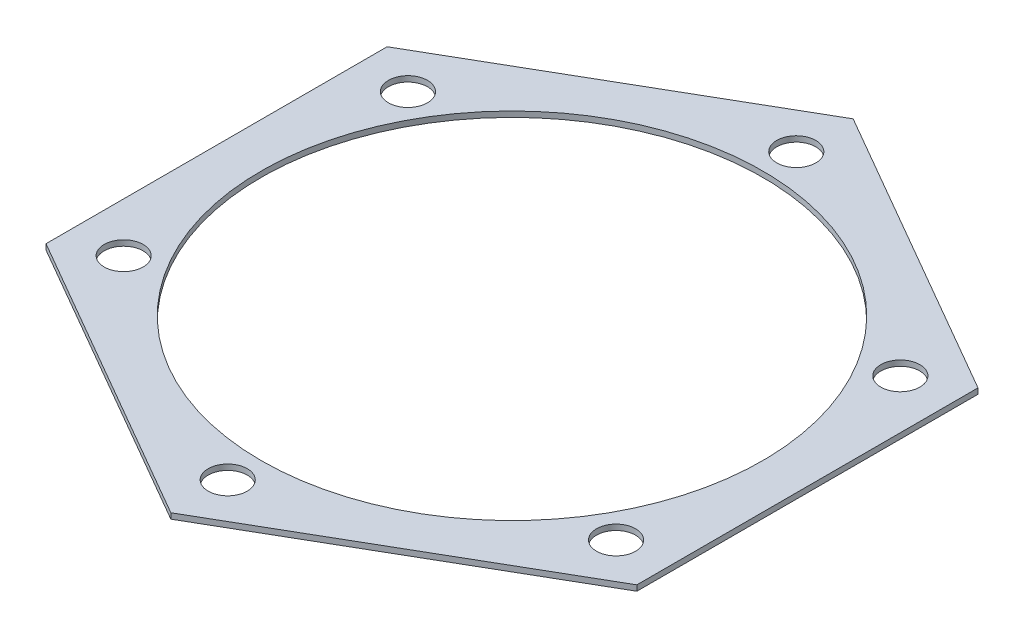
ISO-10303-21;
HEADER;
FILE_DESCRIPTION(('STEP AP214'),'2;1');
FILE_NAME('part.step','',(''),(''),'','','');
FILE_SCHEMA(('AUTOMOTIVE_DESIGN { 1 0 10303 214 1 1 1 1 }'));
ENDSEC;
DATA;
#1=APPLICATION_CONTEXT('core data for automotive mechanical design processes');
#2=APPLICATION_PROTOCOL_DEFINITION('international standard','automotive_design',2000,#1);
#3=PRODUCT_CONTEXT('',#1,'mechanical');
#4=PRODUCT('Part','Part','',(#3));
#5=PRODUCT_RELATED_PRODUCT_CATEGORY('part','',(#4));
#6=PRODUCT_DEFINITION_FORMATION('','',#4);
#7=PRODUCT_DEFINITION_CONTEXT('part definition',#1,'design');
#8=PRODUCT_DEFINITION('design','',#6,#7);
#9=PRODUCT_DEFINITION_SHAPE('','',#8);
#10=(LENGTH_UNIT() NAMED_UNIT(*) SI_UNIT(.MILLI.,.METRE.));
#11=(NAMED_UNIT(*) PLANE_ANGLE_UNIT() SI_UNIT($,.RADIAN.));
#12=(NAMED_UNIT(*) SI_UNIT($,.STERADIAN.) SOLID_ANGLE_UNIT());
#13=UNCERTAINTY_MEASURE_WITH_UNIT(LENGTH_MEASURE(1.E-05),#10,'distance_accuracy_value','');
#14=(GEOMETRIC_REPRESENTATION_CONTEXT(3) GLOBAL_UNCERTAINTY_ASSIGNED_CONTEXT((#13)) GLOBAL_UNIT_ASSIGNED_CONTEXT((#10,
#11,#12)) REPRESENTATION_CONTEXT('',''));
#15=CARTESIAN_POINT('',(0.,0.,0.));
#16=DIRECTION('',(0.,0.,1.));
#17=DIRECTION('',(1.,0.,0.));
#18=AXIS2_PLACEMENT_3D('',#15,#16,#17);
#19=CARTESIAN_POINT('',(52.9999999999997,1.,-30.5995642670508));
#20=DIRECTION('',(-0.499999999999995,0.,0.866025403784441));
#21=DIRECTION('',(0.866025403784442,0.,0.499999999999995));
#22=AXIS2_PLACEMENT_3D('',#19,#20,#21);
#23=PLANE('',#22);
#24=DIRECTION('',(-0.866025403784441,0.,-0.499999999999995));
#25=VECTOR('',#24,1.);
#26=CARTESIAN_POINT('',(52.9999999999997,0.,-30.5995642670508));
#27=LINE('',#26,#25);
#28=CARTESIAN_POINT('',(52.9999999999997,0.,-30.5995642670508));
#29=VERTEX_POINT('',#28);
#30=CARTESIAN_POINT('',(0.,0.,-61.1991285341004));
#31=VERTEX_POINT('',#30);
#32=EDGE_CURVE('E117',#29,#31,#27,.T.);
#33=ORIENTED_EDGE('',*,*,#32,.T.);
#34=DIRECTION('',(0.,-1.,0.));
#35=VECTOR('',#34,1.);
#36=CARTESIAN_POINT('',(0.,1.,-61.1991285341004));
#37=LINE('',#36,#35);
#38=CARTESIAN_POINT('',(0.,1.,-61.1991285341004));
#39=VERTEX_POINT('',#38);
#40=EDGE_CURVE('E11',#39,#31,#37,.T.);
#41=ORIENTED_EDGE('',*,*,#40,.F.);
#42=DIRECTION('',(-0.866025403784441,0.,-0.499999999999995));
#43=VECTOR('',#42,1.);
#44=CARTESIAN_POINT('',(52.9999999999997,1.,-30.5995642670508));
#45=LINE('',#44,#43);
#46=CARTESIAN_POINT('',(52.9999999999997,1.,-30.5995642670508));
#47=VERTEX_POINT('',#46);
#48=EDGE_CURVE('E128',#47,#39,#45,.T.);
#49=ORIENTED_EDGE('',*,*,#48,.F.);
#50=DIRECTION('',(0.,-1.,0.));
#51=VECTOR('',#50,1.);
#52=CARTESIAN_POINT('',(52.9999999999997,1.,-30.5995642670508));
#53=LINE('',#52,#51);
#54=EDGE_CURVE('E113',#47,#29,#53,.T.);
#55=ORIENTED_EDGE('',*,*,#54,.T.);
#56=EDGE_LOOP('',(#33,#41,#49,#55));
#57=FACE_BOUND('',#56,.T.);
#58=ADVANCED_FACE('F33',(#57),#23,.F.);
#59=CARTESIAN_POINT('',(0.,1.,-61.1991285341004));
#60=DIRECTION('',(0.500000000000001,0.,0.866025403784438));
#61=DIRECTION('',(0.866025403784438,0.,-0.500000000000001));
#62=AXIS2_PLACEMENT_3D('',#59,#60,#61);
#63=PLANE('',#62);
#64=DIRECTION('',(-0.866025403784438,0.,0.500000000000001));
#65=VECTOR('',#64,1.);
#66=CARTESIAN_POINT('',(0.,0.,-61.1991285341004));
#67=LINE('',#66,#65);
#68=CARTESIAN_POINT('',(-53.0000000000001,0.,-30.5995642670501));
#69=VERTEX_POINT('',#68);
#70=EDGE_CURVE('E120',#31,#69,#67,.T.);
#71=ORIENTED_EDGE('',*,*,#70,.T.);
#72=DIRECTION('',(0.,-1.,0.));
#73=VECTOR('',#72,1.);
#74=CARTESIAN_POINT('',(-53.0000000000001,1.,-30.5995642670501));
#75=LINE('',#74,#73);
#76=CARTESIAN_POINT('',(-53.0000000000001,1.,-30.5995642670501));
#77=VERTEX_POINT('',#76);
#78=EDGE_CURVE('E41',#77,#69,#75,.T.);
#79=ORIENTED_EDGE('',*,*,#78,.F.);
#80=DIRECTION('',(-0.866025403784438,0.,0.500000000000001));
#81=VECTOR('',#80,1.);
#82=CARTESIAN_POINT('',(0.,1.,-61.1991285341004));
#83=LINE('',#82,#81);
#84=EDGE_CURVE('E86',#39,#77,#83,.T.);
#85=ORIENTED_EDGE('',*,*,#84,.F.);
#86=ORIENTED_EDGE('',*,*,#40,.T.);
#87=EDGE_LOOP('',(#71,#79,#85,#86));
#88=FACE_BOUND('',#87,.T.);
#89=ADVANCED_FACE('F153',(#88),#63,.F.);
#90=CARTESIAN_POINT('',(-53.0000000000001,1.,-30.5995642670501));
#91=DIRECTION('',(1.,0.,0.));
#92=DIRECTION('',(0.,0.,-1.));
#93=AXIS2_PLACEMENT_3D('',#90,#91,#92);
#94=PLANE('',#93);
#95=DIRECTION('',(0.,0.,1.));
#96=VECTOR('',#95,1.);
#97=CARTESIAN_POINT('',(-53.0000000000001,0.,-30.5995642670501));
#98=LINE('',#97,#96);
#99=CARTESIAN_POINT('',(-52.9999999999999,0.,30.5995642670504));
#100=VERTEX_POINT('',#99);
#101=EDGE_CURVE('E123',#69,#100,#98,.T.);
#102=ORIENTED_EDGE('',*,*,#101,.T.);
#103=DIRECTION('',(0.,-1.,0.));
#104=VECTOR('',#103,1.);
#105=CARTESIAN_POINT('',(-52.9999999999999,1.,30.5995642670504));
#106=LINE('',#105,#104);
#107=CARTESIAN_POINT('',(-52.9999999999999,1.,30.5995642670504));
#108=VERTEX_POINT('',#107);
#109=EDGE_CURVE('E108',#108,#100,#106,.T.);
#110=ORIENTED_EDGE('',*,*,#109,.F.);
#111=DIRECTION('',(0.,0.,1.));
#112=VECTOR('',#111,1.);
#113=CARTESIAN_POINT('',(-53.0000000000001,1.,-30.5995642670501));
#114=LINE('',#113,#112);
#115=EDGE_CURVE('E99',#77,#108,#114,.T.);
#116=ORIENTED_EDGE('',*,*,#115,.F.);
#117=ORIENTED_EDGE('',*,*,#78,.T.);
#118=EDGE_LOOP('',(#102,#110,#116,#117));
#119=FACE_BOUND('',#118,.T.);
#120=ADVANCED_FACE('F134',(#119),#94,.F.);
#121=CARTESIAN_POINT('',(-52.9999999999999,1.,30.5995642670504));
#122=DIRECTION('',(0.499999999999995,0.,-0.866025403784442));
#123=DIRECTION('',(-0.866025403784442,0.,-0.499999999999995));
#124=AXIS2_PLACEMENT_3D('',#121,#122,#123);
#125=PLANE('',#124);
#126=DIRECTION('',(0.866025403784442,0.,0.499999999999995));
#127=VECTOR('',#126,1.);
#128=CARTESIAN_POINT('',(-52.9999999999999,0.,30.5995642670504));
#129=LINE('',#128,#127);
#130=CARTESIAN_POINT('',(4.27351230460547E-13,0.,61.1991285341004));
#131=VERTEX_POINT('',#130);
#132=EDGE_CURVE('E107',#100,#131,#129,.T.);
#133=ORIENTED_EDGE('',*,*,#132,.T.);
#134=DIRECTION('',(0.,-1.,0.));
#135=VECTOR('',#134,1.);
#136=CARTESIAN_POINT('',(4.27351230460547E-13,1.,61.1991285341004));
#137=LINE('',#136,#135);
#138=CARTESIAN_POINT('',(4.27351230460547E-13,1.,61.1991285341004));
#139=VERTEX_POINT('',#138);
#140=EDGE_CURVE('E104',#139,#131,#137,.T.);
#141=ORIENTED_EDGE('',*,*,#140,.F.);
#142=DIRECTION('',(0.866025403784442,0.,0.499999999999995));
#143=VECTOR('',#142,1.);
#144=CARTESIAN_POINT('',(-52.9999999999999,1.,30.5995642670504));
#145=LINE('',#144,#143);
#146=EDGE_CURVE('E93',#108,#139,#145,.T.);
#147=ORIENTED_EDGE('',*,*,#146,.F.);
#148=ORIENTED_EDGE('',*,*,#109,.T.);
#149=EDGE_LOOP('',(#133,#141,#147,#148));
#150=FACE_BOUND('',#149,.T.);
#151=ADVANCED_FACE('F105',(#150),#125,.F.);
#152=CARTESIAN_POINT('',(4.27351230460547E-13,1.,61.1991285341004));
#153=DIRECTION('',(-0.500000000000007,0.,-0.866025403784435));
#154=DIRECTION('',(-0.866025403784435,0.,0.500000000000007));
#155=AXIS2_PLACEMENT_3D('',#152,#153,#154);
#156=PLANE('',#155);
#157=DIRECTION('',(0.866025403784435,0.,-0.500000000000007));
#158=VECTOR('',#157,1.);
#159=CARTESIAN_POINT('',(4.27351230460547E-13,0.,61.1991285341004));
#160=LINE('',#159,#158);
#161=CARTESIAN_POINT('',(53.0000000000003,0.,30.5995642670497));
#162=VERTEX_POINT('',#161);
#163=EDGE_CURVE('E72',#131,#162,#160,.T.);
#164=ORIENTED_EDGE('',*,*,#163,.T.);
#165=DIRECTION('',(0.,-1.,0.));
#166=VECTOR('',#165,1.);
#167=CARTESIAN_POINT('',(53.0000000000003,1.,30.5995642670497));
#168=LINE('',#167,#166);
#169=CARTESIAN_POINT('',(53.0000000000003,1.,30.5995642670497));
#170=VERTEX_POINT('',#169);
#171=EDGE_CURVE('E109',#170,#162,#168,.T.);
#172=ORIENTED_EDGE('',*,*,#171,.F.);
#173=DIRECTION('',(0.866025403784435,0.,-0.500000000000007));
#174=VECTOR('',#173,1.);
#175=CARTESIAN_POINT('',(4.27351230460547E-13,1.,61.1991285341004));
#176=LINE('',#175,#174);
#177=EDGE_CURVE('E97',#139,#170,#176,.T.);
#178=ORIENTED_EDGE('',*,*,#177,.F.);
#179=ORIENTED_EDGE('',*,*,#140,.T.);
#180=EDGE_LOOP('',(#164,#172,#178,#179));
#181=FACE_BOUND('',#180,.T.);
#182=ADVANCED_FACE('F111',(#181),#156,.F.);
#183=CARTESIAN_POINT('',(53.0000000000003,1.,30.5995642670497));
#184=DIRECTION('',(-1.,0.,0.));
#185=DIRECTION('',(0.,0.,1.));
#186=AXIS2_PLACEMENT_3D('',#183,#184,#185);
#187=PLANE('',#186);
#188=DIRECTION('',(0.,0.,-1.));
#189=VECTOR('',#188,1.);
#190=CARTESIAN_POINT('',(53.0000000000003,0.,30.5995642670497));
#191=LINE('',#190,#189);
#192=EDGE_CURVE('E78',#162,#29,#191,.T.);
#193=ORIENTED_EDGE('',*,*,#192,.T.);
#194=ORIENTED_EDGE('',*,*,#54,.F.);
#195=DIRECTION('',(0.,0.,-1.));
#196=VECTOR('',#195,1.);
#197=CARTESIAN_POINT('',(53.0000000000003,1.,30.5995642670497));
#198=LINE('',#197,#196);
#199=EDGE_CURVE('E49',#170,#47,#198,.T.);
#200=ORIENTED_EDGE('',*,*,#199,.F.);
#201=ORIENTED_EDGE('',*,*,#171,.T.);
#202=EDGE_LOOP('',(#193,#194,#200,#201));
#203=FACE_BOUND('',#202,.T.);
#204=ADVANCED_FACE('F141',(#203),#187,.F.);
#205=CARTESIAN_POINT('',(0.,1.,0.));
#206=DIRECTION('',(0.,1.,0.));
#207=DIRECTION('',(0.,0.,1.));
#208=AXIS2_PLACEMENT_3D('',#205,#206,#207);
#209=PLANE('',#208);
#210=CARTESIAN_POINT('',(-44.1672955930049,1.,-25.4999999999975));
#211=DIRECTION('',(0.,1.,0.));
#212=DIRECTION('',(0.,0.,1.));
#213=AXIS2_PLACEMENT_3D('',#210,#211,#212);
#214=CIRCLE('',#213,3.50000000000272);
#215=CARTESIAN_POINT('',(-44.1672955930049,1.,-21.9999999999947));
#216=VERTEX_POINT('',#215);
#217=EDGE_CURVE('E269',#216,#216,#214,.T.);
#218=ORIENTED_EDGE('',*,*,#217,.F.);
#219=EDGE_LOOP('',(#218));
#220=FACE_BOUND('',#219,.T.);
#221=CARTESIAN_POINT('',(-44.167295593002,1.,25.5000000000025));
#222=DIRECTION('',(0.,1.,0.));
#223=DIRECTION('',(0.,0.,1.));
#224=AXIS2_PLACEMENT_3D('',#221,#222,#223);
#225=CIRCLE('',#224,3.50000000000536);
#226=CARTESIAN_POINT('',(-44.167295593002,1.,29.0000000000079));
#227=VERTEX_POINT('',#226);
#228=EDGE_CURVE('E271',#227,#227,#225,.T.);
#229=ORIENTED_EDGE('',*,*,#228,.F.);
#230=EDGE_LOOP('',(#229));
#231=FACE_BOUND('',#230,.T.);
#232=CARTESIAN_POINT('',(5.77929162777546E-12,1.,51.));
#233=DIRECTION('',(0.,1.,0.));
#234=DIRECTION('',(0.,0.,1.));
#235=AXIS2_PLACEMENT_3D('',#232,#233,#234);
#236=CIRCLE('',#235,3.50000000000587);
#237=CARTESIAN_POINT('',(5.77929162777546E-12,1.,54.5000000000059));
#238=VERTEX_POINT('',#237);
#239=EDGE_CURVE('E307',#238,#238,#236,.T.);
#240=ORIENTED_EDGE('',*,*,#239,.F.);
#241=EDGE_LOOP('',(#240));
#242=FACE_BOUND('',#241,.T.);
#243=CARTESIAN_POINT('',(44.1672955930107,1.,25.4999999999975));
#244=DIRECTION('',(0.,1.,0.));
#245=DIRECTION('',(0.,0.,1.));
#246=AXIS2_PLACEMENT_3D('',#243,#244,#245);
#247=CIRCLE('',#246,3.50000000000365);
#248=CARTESIAN_POINT('',(44.1672955930107,1.,29.0000000000011));
#249=VERTEX_POINT('',#248);
#250=EDGE_CURVE('E301',#249,#249,#247,.T.);
#251=ORIENTED_EDGE('',*,*,#250,.F.);
#252=EDGE_LOOP('',(#251));
#253=FACE_BOUND('',#252,.T.);
#254=CARTESIAN_POINT('',(44.1672955930078,1.,-25.5000000000025));
#255=DIRECTION('',(0.,1.,0.));
#256=DIRECTION('',(0.,0.,1.));
#257=AXIS2_PLACEMENT_3D('',#254,#255,#256);
#258=CIRCLE('',#257,3.50000000000079);
#259=CARTESIAN_POINT('',(44.1672955930078,1.,-22.0000000000017));
#260=VERTEX_POINT('',#259);
#261=EDGE_CURVE('E295',#260,#260,#258,.T.);
#262=ORIENTED_EDGE('',*,*,#261,.F.);
#263=EDGE_LOOP('',(#262));
#264=FACE_BOUND('',#263,.T.);
#265=CARTESIAN_POINT('',(0.,1.,-51.));
#266=DIRECTION('',(0.,1.,0.));
#267=DIRECTION('',(0.,0.,1.));
#268=AXIS2_PLACEMENT_3D('',#265,#266,#267);
#269=CIRCLE('',#268,3.5);
#270=CARTESIAN_POINT('',(0.,1.,-47.5));
#271=VERTEX_POINT('',#270);
#272=EDGE_CURVE('E285',#271,#271,#269,.T.);
#273=ORIENTED_EDGE('',*,*,#272,.F.);
#274=EDGE_LOOP('',(#273));
#275=FACE_BOUND('',#274,.T.);
#276=CARTESIAN_POINT('',(0.,1.,0.));
#277=DIRECTION('',(0.,1.,0.));
#278=DIRECTION('',(0.,0.,1.));
#279=AXIS2_PLACEMENT_3D('',#276,#277,#278);
#280=CIRCLE('',#279,45.);
#281=CARTESIAN_POINT('',(0.,1.,45.));
#282=VERTEX_POINT('',#281);
#283=EDGE_CURVE('E277',#282,#282,#280,.T.);
#284=ORIENTED_EDGE('',*,*,#283,.F.);
#285=EDGE_LOOP('',(#284));
#286=FACE_BOUND('',#285,.T.);
#287=ORIENTED_EDGE('',*,*,#48,.T.);
#288=ORIENTED_EDGE('',*,*,#84,.T.);
#289=ORIENTED_EDGE('',*,*,#115,.T.);
#290=ORIENTED_EDGE('',*,*,#146,.T.);
#291=ORIENTED_EDGE('',*,*,#177,.T.);
#292=ORIENTED_EDGE('',*,*,#199,.T.);
#293=EDGE_LOOP('',(#287,#288,#289,#290,#291,#292));
#294=FACE_BOUND('',#293,.T.);
#295=ADVANCED_FACE('F95',(#220,#231,#242,#253,#264,#275,#286,#294),#209,.T.);
#296=CARTESIAN_POINT('',(0.,0.,0.));
#297=DIRECTION('',(0.,1.,0.));
#298=DIRECTION('',(0.,0.,1.));
#299=AXIS2_PLACEMENT_3D('',#296,#297,#298);
#300=PLANE('',#299);
#301=CARTESIAN_POINT('',(-44.1672955930049,0.,-25.4999999999975));
#302=DIRECTION('',(0.,1.,0.));
#303=DIRECTION('',(0.,0.,1.));
#304=AXIS2_PLACEMENT_3D('',#301,#302,#303);
#305=CIRCLE('',#304,3.50000000000272);
#306=CARTESIAN_POINT('',(-44.1672955930049,0.,-21.9999999999947));
#307=VERTEX_POINT('',#306);
#308=EDGE_CURVE('E266',#307,#307,#305,.T.);
#309=ORIENTED_EDGE('',*,*,#308,.T.);
#310=EDGE_LOOP('',(#309));
#311=FACE_BOUND('',#310,.T.);
#312=CARTESIAN_POINT('',(-44.167295593002,0.,25.5000000000025));
#313=DIRECTION('',(0.,1.,0.));
#314=DIRECTION('',(0.,0.,1.));
#315=AXIS2_PLACEMENT_3D('',#312,#313,#314);
#316=CIRCLE('',#315,3.50000000000536);
#317=CARTESIAN_POINT('',(-44.167295593002,0.,29.0000000000079));
#318=VERTEX_POINT('',#317);
#319=EDGE_CURVE('E310',#318,#318,#316,.T.);
#320=ORIENTED_EDGE('',*,*,#319,.T.);
#321=EDGE_LOOP('',(#320));
#322=FACE_BOUND('',#321,.T.);
#323=CARTESIAN_POINT('',(5.77929162777546E-12,0.,51.));
#324=DIRECTION('',(0.,1.,0.));
#325=DIRECTION('',(0.,0.,1.));
#326=AXIS2_PLACEMENT_3D('',#323,#324,#325);
#327=CIRCLE('',#326,3.50000000000587);
#328=CARTESIAN_POINT('',(5.77929162777546E-12,0.,54.5000000000059));
#329=VERTEX_POINT('',#328);
#330=EDGE_CURVE('E304',#329,#329,#327,.T.);
#331=ORIENTED_EDGE('',*,*,#330,.T.);
#332=EDGE_LOOP('',(#331));
#333=FACE_BOUND('',#332,.T.);
#334=CARTESIAN_POINT('',(44.1672955930107,0.,25.4999999999975));
#335=DIRECTION('',(0.,1.,0.));
#336=DIRECTION('',(0.,0.,1.));
#337=AXIS2_PLACEMENT_3D('',#334,#335,#336);
#338=CIRCLE('',#337,3.50000000000365);
#339=CARTESIAN_POINT('',(44.1672955930107,0.,29.0000000000011));
#340=VERTEX_POINT('',#339);
#341=EDGE_CURVE('E298',#340,#340,#338,.T.);
#342=ORIENTED_EDGE('',*,*,#341,.T.);
#343=EDGE_LOOP('',(#342));
#344=FACE_BOUND('',#343,.T.);
#345=CARTESIAN_POINT('',(44.1672955930078,0.,-25.5000000000025));
#346=DIRECTION('',(0.,1.,0.));
#347=DIRECTION('',(0.,0.,1.));
#348=AXIS2_PLACEMENT_3D('',#345,#346,#347);
#349=CIRCLE('',#348,3.50000000000079);
#350=CARTESIAN_POINT('',(44.1672955930078,0.,-22.0000000000017));
#351=VERTEX_POINT('',#350);
#352=EDGE_CURVE('E290',#351,#351,#349,.T.);
#353=ORIENTED_EDGE('',*,*,#352,.T.);
#354=EDGE_LOOP('',(#353));
#355=FACE_BOUND('',#354,.T.);
#356=CARTESIAN_POINT('',(0.,0.,-51.));
#357=DIRECTION('',(0.,1.,0.));
#358=DIRECTION('',(0.,0.,1.));
#359=AXIS2_PLACEMENT_3D('',#356,#357,#358);
#360=CIRCLE('',#359,3.5);
#361=CARTESIAN_POINT('',(0.,0.,-47.5));
#362=VERTEX_POINT('',#361);
#363=EDGE_CURVE('E280',#362,#362,#360,.T.);
#364=ORIENTED_EDGE('',*,*,#363,.T.);
#365=EDGE_LOOP('',(#364));
#366=FACE_BOUND('',#365,.T.);
#367=CARTESIAN_POINT('',(0.,0.,0.));
#368=DIRECTION('',(0.,1.,0.));
#369=DIRECTION('',(0.,0.,1.));
#370=AXIS2_PLACEMENT_3D('',#367,#368,#369);
#371=CIRCLE('',#370,45.);
#372=CARTESIAN_POINT('',(0.,0.,45.));
#373=VERTEX_POINT('',#372);
#374=EDGE_CURVE('E121',#373,#373,#371,.T.);
#375=ORIENTED_EDGE('',*,*,#374,.T.);
#376=EDGE_LOOP('',(#375));
#377=FACE_BOUND('',#376,.T.);
#378=ORIENTED_EDGE('',*,*,#32,.F.);
#379=ORIENTED_EDGE('',*,*,#192,.F.);
#380=ORIENTED_EDGE('',*,*,#163,.F.);
#381=ORIENTED_EDGE('',*,*,#132,.F.);
#382=ORIENTED_EDGE('',*,*,#101,.F.);
#383=ORIENTED_EDGE('',*,*,#70,.F.);
#384=EDGE_LOOP('',(#378,#379,#380,#381,#382,#383));
#385=FACE_BOUND('',#384,.T.);
#386=ADVANCED_FACE('F137',(#311,#322,#333,#344,#355,#366,#377,#385),#300,.F.);
#387=CARTESIAN_POINT('',(0.,0.,0.));
#388=DIRECTION('',(0.,1.,0.));
#389=DIRECTION('',(0.,0.,1.));
#390=AXIS2_PLACEMENT_3D('',#387,#388,#389);
#391=CYLINDRICAL_SURFACE('',#390,45.);
#392=ORIENTED_EDGE('',*,*,#374,.F.);
#393=EDGE_LOOP('',(#392));
#394=FACE_BOUND('',#393,.T.);
#395=ORIENTED_EDGE('',*,*,#283,.T.);
#396=EDGE_LOOP('',(#395));
#397=FACE_BOUND('',#396,.T.);
#398=ADVANCED_FACE('F190',(#394,#397),#391,.F.);
#399=CARTESIAN_POINT('',(0.,0.,-51.));
#400=DIRECTION('',(0.,1.,0.));
#401=DIRECTION('',(0.,0.,1.));
#402=AXIS2_PLACEMENT_3D('',#399,#400,#401);
#403=CYLINDRICAL_SURFACE('',#402,3.5);
#404=ORIENTED_EDGE('',*,*,#363,.F.);
#405=EDGE_LOOP('',(#404));
#406=FACE_BOUND('',#405,.T.);
#407=ORIENTED_EDGE('',*,*,#272,.T.);
#408=EDGE_LOOP('',(#407));
#409=FACE_BOUND('',#408,.T.);
#410=ADVANCED_FACE('F199',(#406,#409),#403,.F.);
#411=CARTESIAN_POINT('',(44.1672955930078,0.,-25.5000000000025));
#412=DIRECTION('',(0.,1.,0.));
#413=DIRECTION('',(0.,0.,1.));
#414=AXIS2_PLACEMENT_3D('',#411,#412,#413);
#415=CYLINDRICAL_SURFACE('',#414,3.50000000000079);
#416=ORIENTED_EDGE('',*,*,#352,.F.);
#417=EDGE_LOOP('',(#416));
#418=FACE_BOUND('',#417,.T.);
#419=ORIENTED_EDGE('',*,*,#261,.T.);
#420=EDGE_LOOP('',(#419));
#421=FACE_BOUND('',#420,.T.);
#422=ADVANCED_FACE('F209',(#418,#421),#415,.F.);
#423=CARTESIAN_POINT('',(44.1672955930107,0.,25.4999999999975));
#424=DIRECTION('',(0.,1.,0.));
#425=DIRECTION('',(0.,0.,1.));
#426=AXIS2_PLACEMENT_3D('',#423,#424,#425);
#427=CYLINDRICAL_SURFACE('',#426,3.50000000000365);
#428=ORIENTED_EDGE('',*,*,#341,.F.);
#429=EDGE_LOOP('',(#428));
#430=FACE_BOUND('',#429,.T.);
#431=ORIENTED_EDGE('',*,*,#250,.T.);
#432=EDGE_LOOP('',(#431));
#433=FACE_BOUND('',#432,.T.);
#434=ADVANCED_FACE('F219',(#430,#433),#427,.F.);
#435=CARTESIAN_POINT('',(5.77929162777546E-12,0.,51.));
#436=DIRECTION('',(0.,1.,0.));
#437=DIRECTION('',(0.,0.,1.));
#438=AXIS2_PLACEMENT_3D('',#435,#436,#437);
#439=CYLINDRICAL_SURFACE('',#438,3.50000000000587);
#440=ORIENTED_EDGE('',*,*,#330,.F.);
#441=EDGE_LOOP('',(#440));
#442=FACE_BOUND('',#441,.T.);
#443=ORIENTED_EDGE('',*,*,#239,.T.);
#444=EDGE_LOOP('',(#443));
#445=FACE_BOUND('',#444,.T.);
#446=ADVANCED_FACE('F229',(#442,#445),#439,.F.);
#447=CARTESIAN_POINT('',(-44.167295593002,0.,25.5000000000025));
#448=DIRECTION('',(0.,1.,0.));
#449=DIRECTION('',(0.,0.,1.));
#450=AXIS2_PLACEMENT_3D('',#447,#448,#449);
#451=CYLINDRICAL_SURFACE('',#450,3.50000000000536);
#452=ORIENTED_EDGE('',*,*,#319,.F.);
#453=EDGE_LOOP('',(#452));
#454=FACE_BOUND('',#453,.T.);
#455=ORIENTED_EDGE('',*,*,#228,.T.);
#456=EDGE_LOOP('',(#455));
#457=FACE_BOUND('',#456,.T.);
#458=ADVANCED_FACE('F239',(#454,#457),#451,.F.);
#459=CARTESIAN_POINT('',(-44.1672955930049,0.,-25.4999999999975));
#460=DIRECTION('',(0.,1.,0.));
#461=DIRECTION('',(0.,0.,1.));
#462=AXIS2_PLACEMENT_3D('',#459,#460,#461);
#463=CYLINDRICAL_SURFACE('',#462,3.50000000000272);
#464=ORIENTED_EDGE('',*,*,#308,.F.);
#465=EDGE_LOOP('',(#464));
#466=FACE_BOUND('',#465,.T.);
#467=ORIENTED_EDGE('',*,*,#217,.T.);
#468=EDGE_LOOP('',(#467));
#469=FACE_BOUND('',#468,.T.);
#470=ADVANCED_FACE('F249',(#466,#469),#463,.F.);
#471=CLOSED_SHELL('',(#58,#89,#120,#151,#182,#204,#295,#386,#398,#410,#422,#434,#446,#458,#470));
#472=MANIFOLD_SOLID_BREP('B2',#471);
#473=ADVANCED_BREP_SHAPE_REPRESENTATION('',(#18,#472),#14);
#474=SHAPE_DEFINITION_REPRESENTATION(#9,#473);
ENDSEC;
END-ISO-10303-21;
